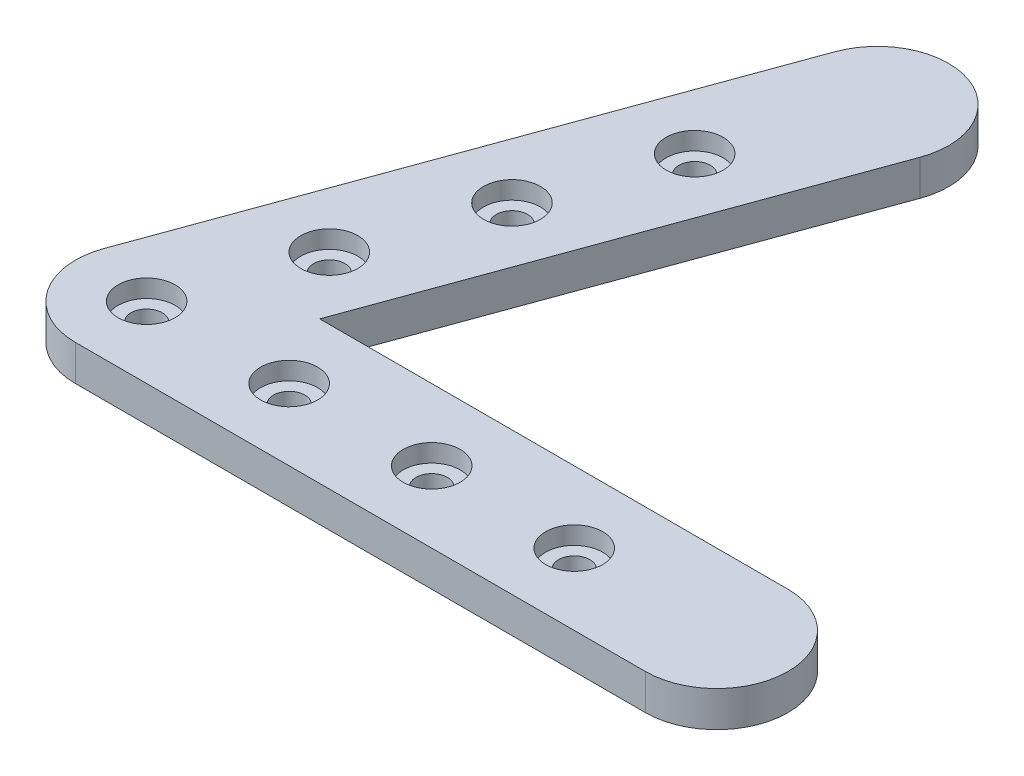
ISO-10303-21;
HEADER;
FILE_DESCRIPTION(('STEP AP214'),'2;1');
FILE_NAME('part.step','',(''),(''),'','','');
FILE_SCHEMA(('AUTOMOTIVE_DESIGN { 1 0 10303 214 1 1 1 1 }'));
ENDSEC;
DATA;
#1=APPLICATION_CONTEXT('core data for automotive mechanical design processes');
#2=APPLICATION_PROTOCOL_DEFINITION('international standard','automotive_design',2000,#1);
#3=PRODUCT_CONTEXT('',#1,'mechanical');
#4=PRODUCT('Part','Part','',(#3));
#5=PRODUCT_RELATED_PRODUCT_CATEGORY('part','',(#4));
#6=PRODUCT_DEFINITION_FORMATION('','',#4);
#7=PRODUCT_DEFINITION_CONTEXT('part definition',#1,'design');
#8=PRODUCT_DEFINITION('design','',#6,#7);
#9=PRODUCT_DEFINITION_SHAPE('','',#8);
#10=(LENGTH_UNIT() NAMED_UNIT(*) SI_UNIT(.MILLI.,.METRE.));
#11=(NAMED_UNIT(*) PLANE_ANGLE_UNIT() SI_UNIT($,.RADIAN.));
#12=(NAMED_UNIT(*) SI_UNIT($,.STERADIAN.) SOLID_ANGLE_UNIT());
#13=UNCERTAINTY_MEASURE_WITH_UNIT(LENGTH_MEASURE(1.E-05),#10,'distance_accuracy_value','');
#14=(GEOMETRIC_REPRESENTATION_CONTEXT(3) GLOBAL_UNCERTAINTY_ASSIGNED_CONTEXT((#13)) GLOBAL_UNIT_ASSIGNED_CONTEXT((#10,
#11,#12)) REPRESENTATION_CONTEXT('',''));
#15=CARTESIAN_POINT('',(0.,0.,0.));
#16=DIRECTION('',(0.,0.,1.));
#17=DIRECTION('',(1.,0.,0.));
#18=AXIS2_PLACEMENT_3D('',#15,#16,#17);
#19=CARTESIAN_POINT('',(0.,6.35,0.));
#20=DIRECTION('',(0.,-1.,0.));
#21=DIRECTION('',(0.,0.,-1.));
#22=AXIS2_PLACEMENT_3D('',#19,#20,#21);
#23=CYLINDRICAL_SURFACE('',#22,2.794);
#24=CARTESIAN_POINT('',(0.,0.,0.));
#25=DIRECTION('',(0.,1.,0.));
#26=DIRECTION('',(0.,0.,1.));
#27=AXIS2_PLACEMENT_3D('',#24,#25,#26);
#28=CIRCLE('',#27,2.794);
#29=CARTESIAN_POINT('',(0.,0.,2.79400000000001));
#30=VERTEX_POINT('',#29);
#31=EDGE_CURVE('E159',#30,#30,#28,.T.);
#32=ORIENTED_EDGE('',*,*,#31,.F.);
#33=EDGE_LOOP('',(#32));
#34=FACE_BOUND('',#33,.T.);
#35=CARTESIAN_POINT('',(0.,3.175,0.));
#36=DIRECTION('',(0.,1.,0.));
#37=DIRECTION('',(0.,0.,1.));
#38=AXIS2_PLACEMENT_3D('',#35,#36,#37);
#39=CIRCLE('',#38,2.794);
#40=CARTESIAN_POINT('',(0.,3.175,2.79400000000001));
#41=VERTEX_POINT('',#40);
#42=EDGE_CURVE('E44',#41,#41,#39,.T.);
#43=ORIENTED_EDGE('',*,*,#42,.T.);
#44=EDGE_LOOP('',(#43));
#45=FACE_BOUND('',#44,.T.);
#46=ADVANCED_FACE('F40',(#34,#45),#23,.F.);
#47=CARTESIAN_POINT('',(50.8,6.35,0.));
#48=DIRECTION('',(0.,-1.,0.));
#49=DIRECTION('',(0.,0.,-1.));
#50=AXIS2_PLACEMENT_3D('',#47,#48,#49);
#51=CYLINDRICAL_SURFACE('',#50,2.794);
#52=CARTESIAN_POINT('',(50.8,0.,0.));
#53=DIRECTION('',(0.,-1.,0.));
#54=DIRECTION('',(0.,0.,-1.));
#55=AXIS2_PLACEMENT_3D('',#52,#53,#54);
#56=CIRCLE('',#55,2.794);
#57=CARTESIAN_POINT('',(50.8,0.,-2.794));
#58=VERTEX_POINT('',#57);
#59=EDGE_CURVE('E142',#58,#58,#56,.T.);
#60=ORIENTED_EDGE('',*,*,#59,.T.);
#61=EDGE_LOOP('',(#60));
#62=FACE_BOUND('',#61,.T.);
#63=CARTESIAN_POINT('',(50.8,3.175,0.));
#64=DIRECTION('',(0.,1.,0.));
#65=DIRECTION('',(0.,0.,1.));
#66=AXIS2_PLACEMENT_3D('',#63,#64,#65);
#67=CIRCLE('',#66,2.794);
#68=CARTESIAN_POINT('',(50.8,3.175,2.794));
#69=VERTEX_POINT('',#68);
#70=EDGE_CURVE('E197',#69,#69,#67,.F.);
#71=ORIENTED_EDGE('',*,*,#70,.F.);
#72=EDGE_LOOP('',(#71));
#73=FACE_BOUND('',#72,.T.);
#74=ADVANCED_FACE('F257',(#62,#73),#51,.F.);
#75=CARTESIAN_POINT('',(8.6873116404719,6.35,-23.8681925679621));
#76=DIRECTION('',(0.,-1.,0.));
#77=DIRECTION('',(0.,0.,-1.));
#78=AXIS2_PLACEMENT_3D('',#75,#76,#77);
#79=CYLINDRICAL_SURFACE('',#78,2.794);
#80=CARTESIAN_POINT('',(8.6873116404719,0.,-23.8681925679621));
#81=DIRECTION('',(0.,-1.,0.));
#82=DIRECTION('',(0.,0.,-1.));
#83=AXIS2_PLACEMENT_3D('',#80,#81,#82);
#84=CIRCLE('',#83,2.794);
#85=CARTESIAN_POINT('',(8.6873116404719,0.,-26.6621925679621));
#86=VERTEX_POINT('',#85);
#87=EDGE_CURVE('E209',#86,#86,#84,.T.);
#88=ORIENTED_EDGE('',*,*,#87,.T.);
#89=EDGE_LOOP('',(#88));
#90=FACE_BOUND('',#89,.T.);
#91=CARTESIAN_POINT('',(8.6873116404719,3.175,-23.8681925679621));
#92=DIRECTION('',(0.,1.,0.));
#93=DIRECTION('',(0.,0.,1.));
#94=AXIS2_PLACEMENT_3D('',#91,#92,#93);
#95=CIRCLE('',#94,2.794);
#96=CARTESIAN_POINT('',(8.6873116404719,3.175,-21.0741925679621));
#97=VERTEX_POINT('',#96);
#98=EDGE_CURVE('E194',#97,#97,#95,.F.);
#99=ORIENTED_EDGE('',*,*,#98,.F.);
#100=EDGE_LOOP('',(#99));
#101=FACE_BOUND('',#100,.T.);
#102=ADVANCED_FACE('F263',(#90,#101),#79,.F.);
#103=CARTESIAN_POINT('',(76.2,6.35,0.));
#104=DIRECTION('',(0.,-1.,0.));
#105=DIRECTION('',(0.,0.,-1.));
#106=AXIS2_PLACEMENT_3D('',#103,#104,#105);
#107=CYLINDRICAL_SURFACE('',#106,2.79400000000001);
#108=CARTESIAN_POINT('',(76.2,0.,0.));
#109=DIRECTION('',(0.,-1.,0.));
#110=DIRECTION('',(0.,0.,-1.));
#111=AXIS2_PLACEMENT_3D('',#108,#109,#110);
#112=CIRCLE('',#111,2.79400000000001);
#113=CARTESIAN_POINT('',(76.2,0.,-2.79400000000001));
#114=VERTEX_POINT('',#113);
#115=EDGE_CURVE('E215',#114,#114,#112,.T.);
#116=ORIENTED_EDGE('',*,*,#115,.T.);
#117=EDGE_LOOP('',(#116));
#118=FACE_BOUND('',#117,.T.);
#119=CARTESIAN_POINT('',(76.2,3.175,0.));
#120=DIRECTION('',(0.,1.,0.));
#121=DIRECTION('',(0.,0.,1.));
#122=AXIS2_PLACEMENT_3D('',#119,#120,#121);
#123=CIRCLE('',#122,2.79400000000001);
#124=CARTESIAN_POINT('',(76.2,3.175,2.79400000000001));
#125=VERTEX_POINT('',#124);
#126=EDGE_CURVE('E190',#125,#125,#123,.F.);
#127=ORIENTED_EDGE('',*,*,#126,.F.);
#128=EDGE_LOOP('',(#127));
#129=FACE_BOUND('',#128,.T.);
#130=ADVANCED_FACE('F469',(#118,#129),#107,.F.);
#131=CARTESIAN_POINT('',(25.4,6.35,0.));
#132=DIRECTION('',(0.,-1.,0.));
#133=DIRECTION('',(0.,0.,-1.));
#134=AXIS2_PLACEMENT_3D('',#131,#132,#133);
#135=CYLINDRICAL_SURFACE('',#134,2.794);
#136=CARTESIAN_POINT('',(25.4,0.,0.));
#137=DIRECTION('',(0.,-1.,0.));
#138=DIRECTION('',(0.,0.,-1.));
#139=AXIS2_PLACEMENT_3D('',#136,#137,#138);
#140=CIRCLE('',#139,2.794);
#141=CARTESIAN_POINT('',(25.4,0.,-2.794));
#142=VERTEX_POINT('',#141);
#143=EDGE_CURVE('E219',#142,#142,#140,.T.);
#144=ORIENTED_EDGE('',*,*,#143,.T.);
#145=EDGE_LOOP('',(#144));
#146=FACE_BOUND('',#145,.T.);
#147=CARTESIAN_POINT('',(25.4,3.175,0.));
#148=DIRECTION('',(0.,1.,0.));
#149=DIRECTION('',(0.,0.,1.));
#150=AXIS2_PLACEMENT_3D('',#147,#148,#149);
#151=CIRCLE('',#150,2.794);
#152=CARTESIAN_POINT('',(25.4,3.175,2.794));
#153=VERTEX_POINT('',#152);
#154=EDGE_CURVE('E186',#153,#153,#151,.F.);
#155=ORIENTED_EDGE('',*,*,#154,.F.);
#156=EDGE_LOOP('',(#155));
#157=FACE_BOUND('',#156,.T.);
#158=ADVANCED_FACE('F478',(#146,#157),#135,.F.);
#159=CARTESIAN_POINT('',(17.3746232809438,6.35,-47.7363851359242));
#160=DIRECTION('',(0.,-1.,0.));
#161=DIRECTION('',(0.,0.,-1.));
#162=AXIS2_PLACEMENT_3D('',#159,#160,#161);
#163=CYLINDRICAL_SURFACE('',#162,2.794);
#164=CARTESIAN_POINT('',(17.3746232809438,0.,-47.7363851359242));
#165=DIRECTION('',(0.,-1.,0.));
#166=DIRECTION('',(0.,0.,-1.));
#167=AXIS2_PLACEMENT_3D('',#164,#165,#166);
#168=CIRCLE('',#167,2.794);
#169=CARTESIAN_POINT('',(17.3746232809438,0.,-50.5303851359242));
#170=VERTEX_POINT('',#169);
#171=EDGE_CURVE('E224',#170,#170,#168,.T.);
#172=ORIENTED_EDGE('',*,*,#171,.T.);
#173=EDGE_LOOP('',(#172));
#174=FACE_BOUND('',#173,.T.);
#175=CARTESIAN_POINT('',(17.3746232809438,3.175,-47.7363851359242));
#176=DIRECTION('',(0.,1.,0.));
#177=DIRECTION('',(0.,0.,1.));
#178=AXIS2_PLACEMENT_3D('',#175,#176,#177);
#179=CIRCLE('',#178,2.794);
#180=CARTESIAN_POINT('',(17.3746232809438,3.175,-44.9423851359242));
#181=VERTEX_POINT('',#180);
#182=EDGE_CURVE('E181',#181,#181,#179,.F.);
#183=ORIENTED_EDGE('',*,*,#182,.F.);
#184=EDGE_LOOP('',(#183));
#185=FACE_BOUND('',#184,.T.);
#186=ADVANCED_FACE('F254',(#174,#185),#163,.F.);
#187=CARTESIAN_POINT('',(26.0619349214157,6.35,-71.6045777038863));
#188=DIRECTION('',(0.,-1.,0.));
#189=DIRECTION('',(0.,0.,-1.));
#190=AXIS2_PLACEMENT_3D('',#187,#188,#189);
#191=CYLINDRICAL_SURFACE('',#190,2.794);
#192=CARTESIAN_POINT('',(26.0619349214157,0.,-71.6045777038863));
#193=DIRECTION('',(0.,-1.,0.));
#194=DIRECTION('',(0.,0.,-1.));
#195=AXIS2_PLACEMENT_3D('',#192,#193,#194);
#196=CIRCLE('',#195,2.794);
#197=CARTESIAN_POINT('',(26.0619349214157,0.,-74.3985777038863));
#198=VERTEX_POINT('',#197);
#199=EDGE_CURVE('E204',#198,#198,#196,.T.);
#200=ORIENTED_EDGE('',*,*,#199,.T.);
#201=EDGE_LOOP('',(#200));
#202=FACE_BOUND('',#201,.T.);
#203=CARTESIAN_POINT('',(26.0619349214157,3.175,-71.6045777038863));
#204=DIRECTION('',(0.,1.,0.));
#205=DIRECTION('',(0.,0.,1.));
#206=AXIS2_PLACEMENT_3D('',#203,#204,#205);
#207=CIRCLE('',#206,2.794);
#208=CARTESIAN_POINT('',(26.0619349214157,3.175,-68.8105777038863));
#209=VERTEX_POINT('',#208);
#210=EDGE_CURVE('E177',#209,#209,#207,.F.);
#211=ORIENTED_EDGE('',*,*,#210,.F.);
#212=EDGE_LOOP('',(#211));
#213=FACE_BOUND('',#212,.T.);
#214=ADVANCED_FACE('F248',(#202,#213),#191,.F.);
#215=CARTESIAN_POINT('',(-11.934096283981,6.35,-4.34365582023595));
#216=DIRECTION('',(-0.93969262078591,0.,-0.342020143325665));
#217=DIRECTION('',(-0.342020143325665,0.,0.93969262078591));
#218=AXIS2_PLACEMENT_3D('',#215,#216,#217);
#219=PLANE('',#218);
#220=DIRECTION('',(0.342020143325665,0.,-0.93969262078591));
#221=VECTOR('',#220,1.);
#222=CARTESIAN_POINT('',(-11.934096283981,0.,-4.34365582023595));
#223=LINE('',#222,#221);
#224=CARTESIAN_POINT('',(-11.934096283981,0.,-4.34365582023595));
#225=VERTEX_POINT('',#224);
#226=CARTESIAN_POINT('',(22.8151502779066,0.,-99.8164260920844));
#227=VERTEX_POINT('',#226);
#228=EDGE_CURVE('E137',#225,#227,#223,.T.);
#229=ORIENTED_EDGE('',*,*,#228,.F.);
#230=DIRECTION('',(0.,-1.,0.));
#231=VECTOR('',#230,1.);
#232=CARTESIAN_POINT('',(-11.934096283981,6.35,-4.34365582023595));
#233=LINE('',#232,#231);
#234=CARTESIAN_POINT('',(-11.934096283981,6.35,-4.34365582023595));
#235=VERTEX_POINT('',#234);
#236=EDGE_CURVE('E11',#235,#225,#233,.T.);
#237=ORIENTED_EDGE('',*,*,#236,.F.);
#238=DIRECTION('',(0.342020143325665,0.,-0.93969262078591));
#239=VECTOR('',#238,1.);
#240=CARTESIAN_POINT('',(-11.934096283981,6.35,-4.34365582023595));
#241=LINE('',#240,#239);
#242=CARTESIAN_POINT('',(22.8151502779066,6.35,-99.8164260920844));
#243=VERTEX_POINT('',#242);
#244=EDGE_CURVE('E163',#235,#243,#241,.T.);
#245=ORIENTED_EDGE('',*,*,#244,.T.);
#246=DIRECTION('',(0.,-1.,0.));
#247=VECTOR('',#246,1.);
#248=CARTESIAN_POINT('',(22.8151502779066,6.35,-99.8164260920844));
#249=LINE('',#248,#247);
#250=EDGE_CURVE('E91',#243,#227,#249,.T.);
#251=ORIENTED_EDGE('',*,*,#250,.T.);
#252=EDGE_LOOP('',(#229,#237,#245,#251));
#253=FACE_BOUND('',#252,.T.);
#254=ADVANCED_FACE('F42',(#253),#219,.T.);
#255=CARTESIAN_POINT('',(0.,6.35,0.));
#256=DIRECTION('',(0.,-1.,0.));
#257=DIRECTION('',(0.,0.,-1.));
#258=AXIS2_PLACEMENT_3D('',#255,#256,#257);
#259=CYLINDRICAL_SURFACE('',#258,12.7);
#260=CARTESIAN_POINT('',(0.,0.,0.));
#261=DIRECTION('',(0.,1.,0.));
#262=DIRECTION('',(0.,0.,1.));
#263=AXIS2_PLACEMENT_3D('',#260,#261,#262);
#264=CIRCLE('',#263,12.7);
#265=CARTESIAN_POINT('',(0.,0.,12.7));
#266=VERTEX_POINT('',#265);
#267=EDGE_CURVE('E141',#225,#266,#264,.T.);
#268=ORIENTED_EDGE('',*,*,#267,.T.);
#269=DIRECTION('',(0.,-1.,0.));
#270=VECTOR('',#269,1.);
#271=CARTESIAN_POINT('',(0.,6.35,12.7));
#272=LINE('',#271,#270);
#273=CARTESIAN_POINT('',(0.,6.35,12.7));
#274=VERTEX_POINT('',#273);
#275=EDGE_CURVE('E51',#274,#266,#272,.T.);
#276=ORIENTED_EDGE('',*,*,#275,.F.);
#277=CARTESIAN_POINT('',(0.,6.35,0.));
#278=DIRECTION('',(0.,1.,0.));
#279=DIRECTION('',(0.,0.,1.));
#280=AXIS2_PLACEMENT_3D('',#277,#278,#279);
#281=CIRCLE('',#280,12.7);
#282=EDGE_CURVE('E227',#235,#274,#281,.T.);
#283=ORIENTED_EDGE('',*,*,#282,.F.);
#284=ORIENTED_EDGE('',*,*,#236,.T.);
#285=EDGE_LOOP('',(#268,#276,#283,#284));
#286=FACE_BOUND('',#285,.T.);
#287=ADVANCED_FACE('F247',(#286),#259,.T.);
#288=CARTESIAN_POINT('',(0.,6.35,12.7));
#289=DIRECTION('',(0.,0.,-1.));
#290=DIRECTION('',(-1.,0.,0.));
#291=AXIS2_PLACEMENT_3D('',#288,#289,#290);
#292=PLANE('',#291);
#293=DIRECTION('',(1.,0.,0.));
#294=VECTOR('',#293,1.);
#295=CARTESIAN_POINT('',(0.,0.,12.7));
#296=LINE('',#295,#294);
#297=CARTESIAN_POINT('',(101.6,0.,12.7));
#298=VERTEX_POINT('',#297);
#299=EDGE_CURVE('E145',#266,#298,#296,.T.);
#300=ORIENTED_EDGE('',*,*,#299,.T.);
#301=DIRECTION('',(0.,-1.,0.));
#302=VECTOR('',#301,1.);
#303=CARTESIAN_POINT('',(101.6,6.35,12.7));
#304=LINE('',#303,#302);
#305=CARTESIAN_POINT('',(101.6,6.35,12.7));
#306=VERTEX_POINT('',#305);
#307=EDGE_CURVE('E170',#306,#298,#304,.T.);
#308=ORIENTED_EDGE('',*,*,#307,.F.);
#309=DIRECTION('',(1.,0.,0.));
#310=VECTOR('',#309,1.);
#311=CARTESIAN_POINT('',(0.,6.35,12.7));
#312=LINE('',#311,#310);
#313=EDGE_CURVE('E131',#274,#306,#312,.T.);
#314=ORIENTED_EDGE('',*,*,#313,.F.);
#315=ORIENTED_EDGE('',*,*,#275,.T.);
#316=EDGE_LOOP('',(#300,#308,#314,#315));
#317=FACE_BOUND('',#316,.T.);
#318=ADVANCED_FACE('F234',(#317),#292,.F.);
#319=CARTESIAN_POINT('',(101.6,6.35,0.));
#320=DIRECTION('',(0.,-1.,0.));
#321=DIRECTION('',(0.,0.,-1.));
#322=AXIS2_PLACEMENT_3D('',#319,#320,#321);
#323=CYLINDRICAL_SURFACE('',#322,12.7);
#324=CARTESIAN_POINT('',(101.6,0.,0.));
#325=DIRECTION('',(0.,1.,0.));
#326=DIRECTION('',(0.,0.,1.));
#327=AXIS2_PLACEMENT_3D('',#324,#325,#326);
#328=CIRCLE('',#327,12.7);
#329=CARTESIAN_POINT('',(101.6,0.,-12.7));
#330=VERTEX_POINT('',#329);
#331=EDGE_CURVE('E148',#298,#330,#328,.T.);
#332=ORIENTED_EDGE('',*,*,#331,.T.);
#333=DIRECTION('',(0.,-1.,0.));
#334=VECTOR('',#333,1.);
#335=CARTESIAN_POINT('',(101.6,6.35,-12.7));
#336=LINE('',#335,#334);
#337=CARTESIAN_POINT('',(101.6,6.35,-12.7));
#338=VERTEX_POINT('',#337);
#339=EDGE_CURVE('E117',#338,#330,#336,.T.);
#340=ORIENTED_EDGE('',*,*,#339,.F.);
#341=CARTESIAN_POINT('',(101.6,6.35,0.));
#342=DIRECTION('',(0.,1.,0.));
#343=DIRECTION('',(0.,0.,1.));
#344=AXIS2_PLACEMENT_3D('',#341,#342,#343);
#345=CIRCLE('',#344,12.7);
#346=EDGE_CURVE('E126',#306,#338,#345,.T.);
#347=ORIENTED_EDGE('',*,*,#346,.F.);
#348=ORIENTED_EDGE('',*,*,#307,.T.);
#349=EDGE_LOOP('',(#332,#340,#347,#348));
#350=FACE_BOUND('',#349,.T.);
#351=ADVANCED_FACE('F238',(#350),#323,.T.);
#352=CARTESIAN_POINT('',(0.,6.35,-12.7));
#353=DIRECTION('',(0.,0.,-1.));
#354=DIRECTION('',(-1.,0.,0.));
#355=AXIS2_PLACEMENT_3D('',#352,#353,#354);
#356=PLANE('',#355);
#357=DIRECTION('',(1.,0.,0.));
#358=VECTOR('',#357,1.);
#359=CARTESIAN_POINT('',(0.,0.,-12.7));
#360=LINE('',#359,#358);
#361=CARTESIAN_POINT('',(18.1374796856248,0.,-12.7));
#362=VERTEX_POINT('',#361);
#363=EDGE_CURVE('E115',#362,#330,#360,.T.);
#364=ORIENTED_EDGE('',*,*,#363,.F.);
#365=DIRECTION('',(0.,-1.,0.));
#366=VECTOR('',#365,1.);
#367=CARTESIAN_POINT('',(18.1374796856248,6.35,-12.7));
#368=LINE('',#367,#366);
#369=CARTESIAN_POINT('',(18.1374796856248,6.35,-12.7));
#370=VERTEX_POINT('',#369);
#371=EDGE_CURVE('E109',#370,#362,#368,.T.);
#372=ORIENTED_EDGE('',*,*,#371,.F.);
#373=DIRECTION('',(1.,0.,0.));
#374=VECTOR('',#373,1.);
#375=CARTESIAN_POINT('',(0.,6.35,-12.7));
#376=LINE('',#375,#374);
#377=EDGE_CURVE('E113',#370,#338,#376,.T.);
#378=ORIENTED_EDGE('',*,*,#377,.T.);
#379=ORIENTED_EDGE('',*,*,#339,.T.);
#380=EDGE_LOOP('',(#364,#372,#378,#379));
#381=FACE_BOUND('',#380,.T.);
#382=ADVANCED_FACE('F111',(#381),#356,.T.);
#383=CARTESIAN_POINT('',(11.934096283981,6.35,4.34365582023595));
#384=DIRECTION('',(-0.939692620785909,0.,-0.342020143325666));
#385=DIRECTION('',(-0.342020143325666,0.,0.93969262078591));
#386=AXIS2_PLACEMENT_3D('',#383,#384,#385);
#387=PLANE('',#386);
#388=DIRECTION('',(0.342020143325666,0.,-0.93969262078591));
#389=VECTOR('',#388,1.);
#390=CARTESIAN_POINT('',(11.934096283981,0.,4.34365582023595));
#391=LINE('',#390,#389);
#392=CARTESIAN_POINT('',(46.6833428458687,0.,-91.1291144516125));
#393=VERTEX_POINT('',#392);
#394=EDGE_CURVE('E84',#362,#393,#391,.T.);
#395=ORIENTED_EDGE('',*,*,#394,.T.);
#396=DIRECTION('',(0.,-1.,0.));
#397=VECTOR('',#396,1.);
#398=CARTESIAN_POINT('',(46.6833428458687,6.35,-91.1291144516125));
#399=LINE('',#398,#397);
#400=CARTESIAN_POINT('',(46.6833428458687,6.35,-91.1291144516125));
#401=VERTEX_POINT('',#400);
#402=EDGE_CURVE('E118',#401,#393,#399,.T.);
#403=ORIENTED_EDGE('',*,*,#402,.F.);
#404=DIRECTION('',(0.342020143325666,0.,-0.93969262078591));
#405=VECTOR('',#404,1.);
#406=CARTESIAN_POINT('',(11.934096283981,6.35,4.34365582023595));
#407=LINE('',#406,#405);
#408=EDGE_CURVE('E120',#370,#401,#407,.T.);
#409=ORIENTED_EDGE('',*,*,#408,.F.);
#410=ORIENTED_EDGE('',*,*,#371,.T.);
#411=EDGE_LOOP('',(#395,#403,#409,#410));
#412=FACE_BOUND('',#411,.T.);
#413=ADVANCED_FACE('F121',(#412),#387,.F.);
#414=CARTESIAN_POINT('',(34.7492465618876,6.35,-95.4727702718484));
#415=DIRECTION('',(0.,-1.,0.));
#416=DIRECTION('',(0.,0.,-1.));
#417=AXIS2_PLACEMENT_3D('',#414,#415,#416);
#418=CYLINDRICAL_SURFACE('',#417,12.7);
#419=CARTESIAN_POINT('',(34.7492465618876,0.,-95.4727702718484));
#420=DIRECTION('',(0.,1.,0.));
#421=DIRECTION('',(0.,0.,1.));
#422=AXIS2_PLACEMENT_3D('',#419,#420,#421);
#423=CIRCLE('',#422,12.7);
#424=EDGE_CURVE('E156',#393,#227,#423,.T.);
#425=ORIENTED_EDGE('',*,*,#424,.T.);
#426=ORIENTED_EDGE('',*,*,#250,.F.);
#427=CARTESIAN_POINT('',(34.7492465618876,6.35,-95.4727702718484));
#428=DIRECTION('',(0.,1.,0.));
#429=DIRECTION('',(0.,0.,1.));
#430=AXIS2_PLACEMENT_3D('',#427,#428,#429);
#431=CIRCLE('',#430,12.7);
#432=EDGE_CURVE('E60',#401,#243,#431,.T.);
#433=ORIENTED_EDGE('',*,*,#432,.F.);
#434=ORIENTED_EDGE('',*,*,#402,.T.);
#435=EDGE_LOOP('',(#425,#426,#433,#434));
#436=FACE_BOUND('',#435,.T.);
#437=ADVANCED_FACE('F245',(#436),#418,.T.);
#438=CARTESIAN_POINT('',(0.,6.35,0.));
#439=DIRECTION('',(0.,1.,0.));
#440=DIRECTION('',(0.,0.,1.));
#441=AXIS2_PLACEMENT_3D('',#438,#439,#440);
#442=PLANE('',#441);
#443=CARTESIAN_POINT('',(26.0619349214157,6.35,-71.6045777038863));
#444=DIRECTION('',(0.,1.,0.));
#445=DIRECTION('',(0.,0.,1.));
#446=AXIS2_PLACEMENT_3D('',#443,#444,#445);
#447=CIRCLE('',#446,5.08);
#448=CARTESIAN_POINT('',(26.0619349214157,6.35,-66.5245777038863));
#449=VERTEX_POINT('',#448);
#450=EDGE_CURVE('E623',#449,#449,#447,.T.);
#451=ORIENTED_EDGE('',*,*,#450,.F.);
#452=EDGE_LOOP('',(#451));
#453=FACE_BOUND('',#452,.T.);
#454=CARTESIAN_POINT('',(17.3746232809438,6.35,-47.7363851359242));
#455=DIRECTION('',(0.,1.,0.));
#456=DIRECTION('',(0.,0.,1.));
#457=AXIS2_PLACEMENT_3D('',#454,#455,#456);
#458=CIRCLE('',#457,5.08);
#459=CARTESIAN_POINT('',(17.3746232809438,6.35,-42.6563851359242));
#460=VERTEX_POINT('',#459);
#461=EDGE_CURVE('E615',#460,#460,#458,.T.);
#462=ORIENTED_EDGE('',*,*,#461,.F.);
#463=EDGE_LOOP('',(#462));
#464=FACE_BOUND('',#463,.T.);
#465=CARTESIAN_POINT('',(8.6873116404719,6.35,-23.8681925679621));
#466=DIRECTION('',(0.,1.,0.));
#467=DIRECTION('',(0.,0.,1.));
#468=AXIS2_PLACEMENT_3D('',#465,#466,#467);
#469=CIRCLE('',#468,5.08);
#470=CARTESIAN_POINT('',(8.6873116404719,6.35,-18.7881925679621));
#471=VERTEX_POINT('',#470);
#472=EDGE_CURVE('E607',#471,#471,#469,.T.);
#473=ORIENTED_EDGE('',*,*,#472,.F.);
#474=EDGE_LOOP('',(#473));
#475=FACE_BOUND('',#474,.T.);
#476=CARTESIAN_POINT('',(0.,6.35,0.));
#477=DIRECTION('',(0.,1.,0.));
#478=DIRECTION('',(0.,0.,1.));
#479=AXIS2_PLACEMENT_3D('',#476,#477,#478);
#480=CIRCLE('',#479,5.08);
#481=CARTESIAN_POINT('',(0.,6.35,5.08));
#482=VERTEX_POINT('',#481);
#483=EDGE_CURVE('E599',#482,#482,#480,.T.);
#484=ORIENTED_EDGE('',*,*,#483,.F.);
#485=EDGE_LOOP('',(#484));
#486=FACE_BOUND('',#485,.T.);
#487=CARTESIAN_POINT('',(25.4,6.35,0.));
#488=DIRECTION('',(0.,1.,0.));
#489=DIRECTION('',(0.,0.,1.));
#490=AXIS2_PLACEMENT_3D('',#487,#488,#489);
#491=CIRCLE('',#490,5.08);
#492=CARTESIAN_POINT('',(25.4,6.35,5.08));
#493=VERTEX_POINT('',#492);
#494=EDGE_CURVE('E591',#493,#493,#491,.T.);
#495=ORIENTED_EDGE('',*,*,#494,.F.);
#496=EDGE_LOOP('',(#495));
#497=FACE_BOUND('',#496,.T.);
#498=CARTESIAN_POINT('',(50.8,6.35,0.));
#499=DIRECTION('',(0.,1.,0.));
#500=DIRECTION('',(0.,0.,1.));
#501=AXIS2_PLACEMENT_3D('',#498,#499,#500);
#502=CIRCLE('',#501,5.08);
#503=CARTESIAN_POINT('',(50.8,6.35,5.08));
#504=VERTEX_POINT('',#503);
#505=EDGE_CURVE('E583',#504,#504,#502,.T.);
#506=ORIENTED_EDGE('',*,*,#505,.F.);
#507=EDGE_LOOP('',(#506));
#508=FACE_BOUND('',#507,.T.);
#509=CARTESIAN_POINT('',(76.2,6.35,0.));
#510=DIRECTION('',(0.,1.,0.));
#511=DIRECTION('',(0.,0.,1.));
#512=AXIS2_PLACEMENT_3D('',#509,#510,#511);
#513=CIRCLE('',#512,5.08);
#514=CARTESIAN_POINT('',(76.2,6.35,5.08));
#515=VERTEX_POINT('',#514);
#516=EDGE_CURVE('E575',#515,#515,#513,.T.);
#517=ORIENTED_EDGE('',*,*,#516,.F.);
#518=EDGE_LOOP('',(#517));
#519=FACE_BOUND('',#518,.T.);
#520=ORIENTED_EDGE('',*,*,#244,.F.);
#521=ORIENTED_EDGE('',*,*,#282,.T.);
#522=ORIENTED_EDGE('',*,*,#313,.T.);
#523=ORIENTED_EDGE('',*,*,#346,.T.);
#524=ORIENTED_EDGE('',*,*,#377,.F.);
#525=ORIENTED_EDGE('',*,*,#408,.T.);
#526=ORIENTED_EDGE('',*,*,#432,.T.);
#527=EDGE_LOOP('',(#520,#521,#522,#523,#524,#525,#526));
#528=FACE_BOUND('',#527,.T.);
#529=ADVANCED_FACE('F124',(#453,#464,#475,#486,#497,#508,#519,#528),#442,.T.);
#530=CARTESIAN_POINT('',(0.,0.,0.));
#531=DIRECTION('',(0.,1.,0.));
#532=DIRECTION('',(0.,0.,1.));
#533=AXIS2_PLACEMENT_3D('',#530,#531,#532);
#534=PLANE('',#533);
#535=ORIENTED_EDGE('',*,*,#199,.F.);
#536=EDGE_LOOP('',(#535));
#537=FACE_BOUND('',#536,.T.);
#538=ORIENTED_EDGE('',*,*,#171,.F.);
#539=EDGE_LOOP('',(#538));
#540=FACE_BOUND('',#539,.T.);
#541=ORIENTED_EDGE('',*,*,#143,.F.);
#542=EDGE_LOOP('',(#541));
#543=FACE_BOUND('',#542,.T.);
#544=ORIENTED_EDGE('',*,*,#115,.F.);
#545=EDGE_LOOP('',(#544));
#546=FACE_BOUND('',#545,.T.);
#547=ORIENTED_EDGE('',*,*,#87,.F.);
#548=EDGE_LOOP('',(#547));
#549=FACE_BOUND('',#548,.T.);
#550=ORIENTED_EDGE('',*,*,#59,.F.);
#551=EDGE_LOOP('',(#550));
#552=FACE_BOUND('',#551,.T.);
#553=ORIENTED_EDGE('',*,*,#228,.T.);
#554=ORIENTED_EDGE('',*,*,#424,.F.);
#555=ORIENTED_EDGE('',*,*,#394,.F.);
#556=ORIENTED_EDGE('',*,*,#363,.T.);
#557=ORIENTED_EDGE('',*,*,#331,.F.);
#558=ORIENTED_EDGE('',*,*,#299,.F.);
#559=ORIENTED_EDGE('',*,*,#267,.F.);
#560=EDGE_LOOP('',(#553,#554,#555,#556,#557,#558,#559));
#561=FACE_BOUND('',#560,.T.);
#562=ORIENTED_EDGE('',*,*,#31,.T.);
#563=EDGE_LOOP('',(#562));
#564=FACE_BOUND('',#563,.T.);
#565=ADVANCED_FACE('F240',(#537,#540,#543,#546,#549,#552,#561,#564),#534,.F.);
#566=CARTESIAN_POINT('',(26.0619349214157,3.175,-71.6045777038863));
#567=DIRECTION('',(0.,1.,0.));
#568=DIRECTION('',(0.,0.,1.));
#569=AXIS2_PLACEMENT_3D('',#566,#567,#568);
#570=PLANE('',#569);
#571=CARTESIAN_POINT('',(26.0619349214157,3.175,-71.6045777038863));
#572=DIRECTION('',(0.,1.,0.));
#573=DIRECTION('',(0.,0.,1.));
#574=AXIS2_PLACEMENT_3D('',#571,#572,#573);
#575=CIRCLE('',#574,5.08);
#576=CARTESIAN_POINT('',(26.0619349214157,3.175,-66.5245777038863));
#577=VERTEX_POINT('',#576);
#578=EDGE_CURVE('E182',#577,#577,#575,.T.);
#579=ORIENTED_EDGE('',*,*,#578,.T.);
#580=EDGE_LOOP('',(#579));
#581=FACE_BOUND('',#580,.T.);
#582=ORIENTED_EDGE('',*,*,#210,.T.);
#583=EDGE_LOOP('',(#582));
#584=FACE_BOUND('',#583,.T.);
#585=ADVANCED_FACE('F313',(#581,#584),#570,.T.);
#586=CARTESIAN_POINT('',(26.0619349214157,3.175,-71.6045777038863));
#587=DIRECTION('',(0.,1.,0.));
#588=DIRECTION('',(0.,0.,1.));
#589=AXIS2_PLACEMENT_3D('',#586,#587,#588);
#590=CYLINDRICAL_SURFACE('',#589,5.08);
#591=ORIENTED_EDGE('',*,*,#578,.F.);
#592=EDGE_LOOP('',(#591));
#593=FACE_BOUND('',#592,.T.);
#594=ORIENTED_EDGE('',*,*,#450,.T.);
#595=EDGE_LOOP('',(#594));
#596=FACE_BOUND('',#595,.T.);
#597=ADVANCED_FACE('F319',(#593,#596),#590,.F.);
#598=CARTESIAN_POINT('',(17.3746232809438,3.175,-47.7363851359242));
#599=DIRECTION('',(0.,1.,0.));
#600=DIRECTION('',(0.,0.,1.));
#601=AXIS2_PLACEMENT_3D('',#598,#599,#600);
#602=PLANE('',#601);
#603=CARTESIAN_POINT('',(17.3746232809438,3.175,-47.7363851359242));
#604=DIRECTION('',(0.,1.,0.));
#605=DIRECTION('',(0.,0.,1.));
#606=AXIS2_PLACEMENT_3D('',#603,#604,#605);
#607=CIRCLE('',#606,5.08);
#608=CARTESIAN_POINT('',(17.3746232809438,3.175,-42.6563851359242));
#609=VERTEX_POINT('',#608);
#610=EDGE_CURVE('E619',#609,#609,#607,.T.);
#611=ORIENTED_EDGE('',*,*,#610,.T.);
#612=EDGE_LOOP('',(#611));
#613=FACE_BOUND('',#612,.T.);
#614=ORIENTED_EDGE('',*,*,#182,.T.);
#615=EDGE_LOOP('',(#614));
#616=FACE_BOUND('',#615,.T.);
#617=ADVANCED_FACE('F327',(#613,#616),#602,.T.);
#618=CARTESIAN_POINT('',(17.3746232809438,3.175,-47.7363851359242));
#619=DIRECTION('',(0.,1.,0.));
#620=DIRECTION('',(0.,0.,1.));
#621=AXIS2_PLACEMENT_3D('',#618,#619,#620);
#622=CYLINDRICAL_SURFACE('',#621,5.08);
#623=ORIENTED_EDGE('',*,*,#610,.F.);
#624=EDGE_LOOP('',(#623));
#625=FACE_BOUND('',#624,.T.);
#626=ORIENTED_EDGE('',*,*,#461,.T.);
#627=EDGE_LOOP('',(#626));
#628=FACE_BOUND('',#627,.T.);
#629=ADVANCED_FACE('F335',(#625,#628),#622,.F.);
#630=CARTESIAN_POINT('',(25.4,3.175,0.));
#631=DIRECTION('',(0.,1.,0.));
#632=DIRECTION('',(0.,0.,1.));
#633=AXIS2_PLACEMENT_3D('',#630,#631,#632);
#634=PLANE('',#633);
#635=CARTESIAN_POINT('',(25.4,3.175,0.));
#636=DIRECTION('',(0.,1.,0.));
#637=DIRECTION('',(0.,0.,1.));
#638=AXIS2_PLACEMENT_3D('',#635,#636,#637);
#639=CIRCLE('',#638,5.08);
#640=CARTESIAN_POINT('',(25.4,3.175,5.08));
#641=VERTEX_POINT('',#640);
#642=EDGE_CURVE('E595',#641,#641,#639,.T.);
#643=ORIENTED_EDGE('',*,*,#642,.T.);
#644=EDGE_LOOP('',(#643));
#645=FACE_BOUND('',#644,.T.);
#646=ORIENTED_EDGE('',*,*,#154,.T.);
#647=EDGE_LOOP('',(#646));
#648=FACE_BOUND('',#647,.T.);
#649=ADVANCED_FACE('F343',(#645,#648),#634,.T.);
#650=CARTESIAN_POINT('',(25.4,3.175,0.));
#651=DIRECTION('',(0.,1.,0.));
#652=DIRECTION('',(0.,0.,1.));
#653=AXIS2_PLACEMENT_3D('',#650,#651,#652);
#654=CYLINDRICAL_SURFACE('',#653,5.08);
#655=ORIENTED_EDGE('',*,*,#642,.F.);
#656=EDGE_LOOP('',(#655));
#657=FACE_BOUND('',#656,.T.);
#658=ORIENTED_EDGE('',*,*,#494,.T.);
#659=EDGE_LOOP('',(#658));
#660=FACE_BOUND('',#659,.T.);
#661=ADVANCED_FACE('F351',(#657,#660),#654,.F.);
#662=CARTESIAN_POINT('',(76.2,3.175,0.));
#663=DIRECTION('',(0.,1.,0.));
#664=DIRECTION('',(0.,0.,1.));
#665=AXIS2_PLACEMENT_3D('',#662,#663,#664);
#666=PLANE('',#665);
#667=CARTESIAN_POINT('',(76.2,3.175,0.));
#668=DIRECTION('',(0.,1.,0.));
#669=DIRECTION('',(0.,0.,1.));
#670=AXIS2_PLACEMENT_3D('',#667,#668,#669);
#671=CIRCLE('',#670,5.08);
#672=CARTESIAN_POINT('',(76.2,3.175,5.08));
#673=VERTEX_POINT('',#672);
#674=EDGE_CURVE('E579',#673,#673,#671,.T.);
#675=ORIENTED_EDGE('',*,*,#674,.T.);
#676=EDGE_LOOP('',(#675));
#677=FACE_BOUND('',#676,.T.);
#678=ORIENTED_EDGE('',*,*,#126,.T.);
#679=EDGE_LOOP('',(#678));
#680=FACE_BOUND('',#679,.T.);
#681=ADVANCED_FACE('F359',(#677,#680),#666,.T.);
#682=CARTESIAN_POINT('',(76.2,3.175,0.));
#683=DIRECTION('',(0.,1.,0.));
#684=DIRECTION('',(0.,0.,1.));
#685=AXIS2_PLACEMENT_3D('',#682,#683,#684);
#686=CYLINDRICAL_SURFACE('',#685,5.08);
#687=ORIENTED_EDGE('',*,*,#674,.F.);
#688=EDGE_LOOP('',(#687));
#689=FACE_BOUND('',#688,.T.);
#690=ORIENTED_EDGE('',*,*,#516,.T.);
#691=EDGE_LOOP('',(#690));
#692=FACE_BOUND('',#691,.T.);
#693=ADVANCED_FACE('F367',(#689,#692),#686,.F.);
#694=CARTESIAN_POINT('',(8.6873116404719,3.175,-23.8681925679621));
#695=DIRECTION('',(0.,1.,0.));
#696=DIRECTION('',(0.,0.,1.));
#697=AXIS2_PLACEMENT_3D('',#694,#695,#696);
#698=PLANE('',#697);
#699=CARTESIAN_POINT('',(8.6873116404719,3.175,-23.8681925679621));
#700=DIRECTION('',(0.,1.,0.));
#701=DIRECTION('',(0.,0.,1.));
#702=AXIS2_PLACEMENT_3D('',#699,#700,#701);
#703=CIRCLE('',#702,5.08);
#704=CARTESIAN_POINT('',(8.6873116404719,3.175,-18.7881925679621));
#705=VERTEX_POINT('',#704);
#706=EDGE_CURVE('E611',#705,#705,#703,.T.);
#707=ORIENTED_EDGE('',*,*,#706,.T.);
#708=EDGE_LOOP('',(#707));
#709=FACE_BOUND('',#708,.T.);
#710=ORIENTED_EDGE('',*,*,#98,.T.);
#711=EDGE_LOOP('',(#710));
#712=FACE_BOUND('',#711,.T.);
#713=ADVANCED_FACE('F375',(#709,#712),#698,.T.);
#714=CARTESIAN_POINT('',(8.6873116404719,3.175,-23.8681925679621));
#715=DIRECTION('',(0.,1.,0.));
#716=DIRECTION('',(0.,0.,1.));
#717=AXIS2_PLACEMENT_3D('',#714,#715,#716);
#718=CYLINDRICAL_SURFACE('',#717,5.08);
#719=ORIENTED_EDGE('',*,*,#706,.F.);
#720=EDGE_LOOP('',(#719));
#721=FACE_BOUND('',#720,.T.);
#722=ORIENTED_EDGE('',*,*,#472,.T.);
#723=EDGE_LOOP('',(#722));
#724=FACE_BOUND('',#723,.T.);
#725=ADVANCED_FACE('F383',(#721,#724),#718,.F.);
#726=CARTESIAN_POINT('',(50.8,3.175,0.));
#727=DIRECTION('',(0.,1.,0.));
#728=DIRECTION('',(0.,0.,1.));
#729=AXIS2_PLACEMENT_3D('',#726,#727,#728);
#730=PLANE('',#729);
#731=CARTESIAN_POINT('',(50.8,3.175,0.));
#732=DIRECTION('',(0.,1.,0.));
#733=DIRECTION('',(0.,0.,1.));
#734=AXIS2_PLACEMENT_3D('',#731,#732,#733);
#735=CIRCLE('',#734,5.08);
#736=CARTESIAN_POINT('',(50.8,3.175,5.08));
#737=VERTEX_POINT('',#736);
#738=EDGE_CURVE('E587',#737,#737,#735,.T.);
#739=ORIENTED_EDGE('',*,*,#738,.T.);
#740=EDGE_LOOP('',(#739));
#741=FACE_BOUND('',#740,.T.);
#742=ORIENTED_EDGE('',*,*,#70,.T.);
#743=EDGE_LOOP('',(#742));
#744=FACE_BOUND('',#743,.T.);
#745=ADVANCED_FACE('F391',(#741,#744),#730,.T.);
#746=CARTESIAN_POINT('',(50.8,3.175,0.));
#747=DIRECTION('',(0.,1.,0.));
#748=DIRECTION('',(0.,0.,1.));
#749=AXIS2_PLACEMENT_3D('',#746,#747,#748);
#750=CYLINDRICAL_SURFACE('',#749,5.08);
#751=ORIENTED_EDGE('',*,*,#738,.F.);
#752=EDGE_LOOP('',(#751));
#753=FACE_BOUND('',#752,.T.);
#754=ORIENTED_EDGE('',*,*,#505,.T.);
#755=EDGE_LOOP('',(#754));
#756=FACE_BOUND('',#755,.T.);
#757=ADVANCED_FACE('F399',(#753,#756),#750,.F.);
#758=CARTESIAN_POINT('',(0.,3.175,0.));
#759=DIRECTION('',(0.,1.,0.));
#760=DIRECTION('',(0.,0.,1.));
#761=AXIS2_PLACEMENT_3D('',#758,#759,#760);
#762=CYLINDRICAL_SURFACE('',#761,5.08);
#763=CARTESIAN_POINT('',(0.,3.175,0.));
#764=DIRECTION('',(0.,1.,0.));
#765=DIRECTION('',(0.,0.,1.));
#766=AXIS2_PLACEMENT_3D('',#763,#764,#765);
#767=CIRCLE('',#766,5.08);
#768=CARTESIAN_POINT('',(0.,3.175,5.08));
#769=VERTEX_POINT('',#768);
#770=EDGE_CURVE('E603',#769,#769,#767,.T.);
#771=ORIENTED_EDGE('',*,*,#770,.F.);
#772=EDGE_LOOP('',(#771));
#773=FACE_BOUND('',#772,.T.);
#774=ORIENTED_EDGE('',*,*,#483,.T.);
#775=EDGE_LOOP('',(#774));
#776=FACE_BOUND('',#775,.T.);
#777=ADVANCED_FACE('F407',(#773,#776),#762,.F.);
#778=CARTESIAN_POINT('',(0.,3.175,0.));
#779=DIRECTION('',(0.,1.,0.));
#780=DIRECTION('',(0.,0.,1.));
#781=AXIS2_PLACEMENT_3D('',#778,#779,#780);
#782=PLANE('',#781);
#783=ORIENTED_EDGE('',*,*,#42,.F.);
#784=EDGE_LOOP('',(#783));
#785=FACE_BOUND('',#784,.T.);
#786=ORIENTED_EDGE('',*,*,#770,.T.);
#787=EDGE_LOOP('',(#786));
#788=FACE_BOUND('',#787,.T.);
#789=ADVANCED_FACE('F415',(#785,#788),#782,.T.);
#790=CLOSED_SHELL('',(#46,#74,#102,#130,#158,#186,#214,#254,#287,#318,#351,#382,#413,#437,#529,
#565,#585,#597,#617,#629,#649,#661,#681,#693,#713,#725,#745,#757,#777,#789));
#791=MANIFOLD_SOLID_BREP('B2',#790);
#792=ADVANCED_BREP_SHAPE_REPRESENTATION('',(#18,#791),#14);
#793=SHAPE_DEFINITION_REPRESENTATION(#9,#792);
ENDSEC;
END-ISO-10303-21;
